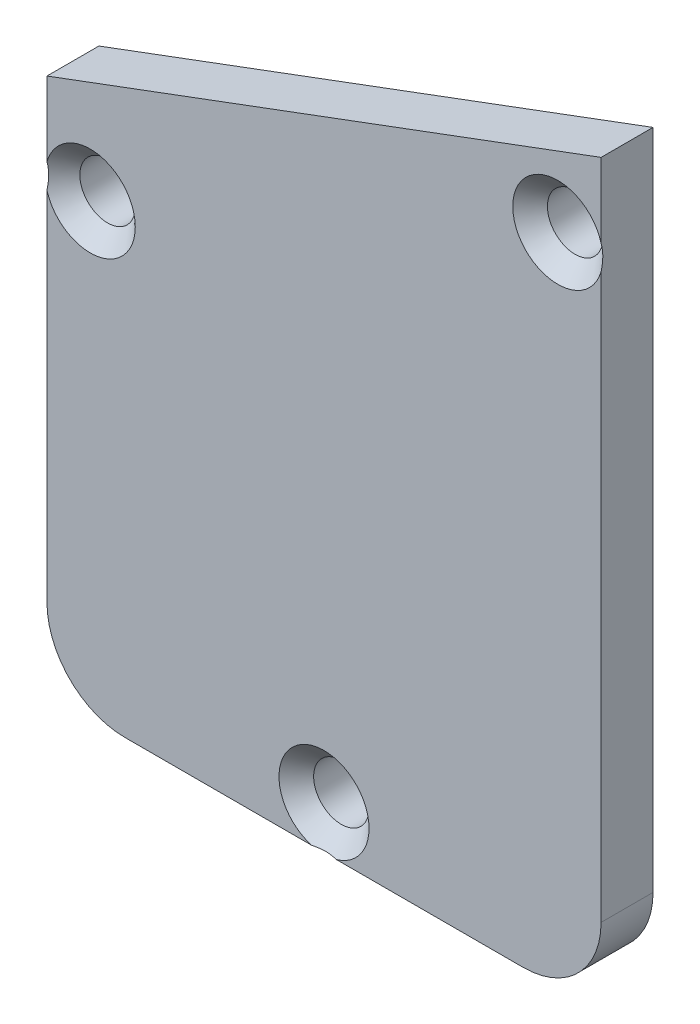
ISO-10303-21;
HEADER;
FILE_DESCRIPTION(('STEP AP214'),'2;1');
FILE_NAME('part.step','',(''),(''),'','','');
FILE_SCHEMA(('AUTOMOTIVE_DESIGN { 1 0 10303 214 1 1 1 1 }'));
ENDSEC;
DATA;
#1=APPLICATION_CONTEXT('core data for automotive mechanical design processes');
#2=APPLICATION_PROTOCOL_DEFINITION('international standard','automotive_design',2000,#1);
#3=PRODUCT_CONTEXT('',#1,'mechanical');
#4=PRODUCT('Part','Part','',(#3));
#5=PRODUCT_RELATED_PRODUCT_CATEGORY('part','',(#4));
#6=PRODUCT_DEFINITION_FORMATION('','',#4);
#7=PRODUCT_DEFINITION_CONTEXT('part definition',#1,'design');
#8=PRODUCT_DEFINITION('design','',#6,#7);
#9=PRODUCT_DEFINITION_SHAPE('','',#8);
#10=(LENGTH_UNIT() NAMED_UNIT(*) SI_UNIT(.MILLI.,.METRE.));
#11=(NAMED_UNIT(*) PLANE_ANGLE_UNIT() SI_UNIT($,.RADIAN.));
#12=(NAMED_UNIT(*) SI_UNIT($,.STERADIAN.) SOLID_ANGLE_UNIT());
#13=UNCERTAINTY_MEASURE_WITH_UNIT(LENGTH_MEASURE(1.E-05),#10,'distance_accuracy_value','');
#14=(GEOMETRIC_REPRESENTATION_CONTEXT(3) GLOBAL_UNCERTAINTY_ASSIGNED_CONTEXT((#13)) GLOBAL_UNIT_ASSIGNED_CONTEXT((#10,
#11,#12)) REPRESENTATION_CONTEXT('',''));
#15=CARTESIAN_POINT('',(0.,0.,0.));
#16=DIRECTION('',(0.,0.,1.));
#17=DIRECTION('',(1.,0.,0.));
#18=AXIS2_PLACEMENT_3D('',#15,#16,#17);
#19=CARTESIAN_POINT('',(12.2995585200825,-15.5607692307692,3.));
#20=DIRECTION('',(0.,0.,-1.));
#21=DIRECTION('',(-1.,0.,0.));
#22=AXIS2_PLACEMENT_3D('',#19,#20,#21);
#23=CYLINDRICAL_SURFACE('',#22,4.5);
#24=CARTESIAN_POINT('',(12.2995585200825,-15.5607692307692,0.));
#25=DIRECTION('',(0.,0.,1.));
#26=DIRECTION('',(1.,0.,0.));
#27=AXIS2_PLACEMENT_3D('',#24,#25,#26);
#28=CIRCLE('',#27,4.5);
#29=CARTESIAN_POINT('',(12.2995585200825,-20.0607692307692,0.));
#30=VERTEX_POINT('',#29);
#31=CARTESIAN_POINT('',(16.7995585200825,-15.5607692307692,0.));
#32=VERTEX_POINT('',#31);
#33=EDGE_CURVE('E151',#30,#32,#28,.T.);
#34=ORIENTED_EDGE('',*,*,#33,.T.);
#35=DIRECTION('',(0.,0.,-1.));
#36=VECTOR('',#35,1.);
#37=CARTESIAN_POINT('',(16.7995585200825,-15.5607692307692,3.));
#38=LINE('',#37,#36);
#39=CARTESIAN_POINT('',(16.7995585200825,-15.5607692307692,3.));
#40=VERTEX_POINT('',#39);
#41=EDGE_CURVE('E130',#40,#32,#38,.T.);
#42=ORIENTED_EDGE('',*,*,#41,.F.);
#43=CARTESIAN_POINT('',(12.2995585200825,-15.5607692307692,3.));
#44=DIRECTION('',(0.,0.,1.));
#45=DIRECTION('',(1.,0.,0.));
#46=AXIS2_PLACEMENT_3D('',#43,#44,#45);
#47=CIRCLE('',#46,4.5);
#48=CARTESIAN_POINT('',(12.2995585200825,-20.0607692307692,3.));
#49=VERTEX_POINT('',#48);
#50=EDGE_CURVE('E141',#49,#40,#47,.T.);
#51=ORIENTED_EDGE('',*,*,#50,.F.);
#52=DIRECTION('',(0.,0.,-1.));
#53=VECTOR('',#52,1.);
#54=CARTESIAN_POINT('',(12.2995585200825,-20.0607692307692,3.));
#55=LINE('',#54,#53);
#56=EDGE_CURVE('E358',#49,#30,#55,.T.);
#57=ORIENTED_EDGE('',*,*,#56,.T.);
#58=EDGE_LOOP('',(#34,#42,#51,#57));
#59=FACE_BOUND('',#58,.T.);
#60=ADVANCED_FACE('F47',(#59),#23,.T.);
#61=CARTESIAN_POINT('',(16.7995585200825,22.6992307692308,3.));
#62=DIRECTION('',(-1.,0.,0.));
#63=DIRECTION('',(0.,0.,1.));
#64=AXIS2_PLACEMENT_3D('',#61,#62,#63);
#65=PLANE('',#64);
#66=DIRECTION('',(0.,1.,0.));
#67=VECTOR('',#66,1.);
#68=CARTESIAN_POINT('',(16.7995585200825,22.6992307692308,3.));
#69=LINE('',#68,#67);
#70=CARTESIAN_POINT('',(16.7995585200825,18.4133736120851,3.));
#71=VERTEX_POINT('',#70);
#72=CARTESIAN_POINT('',(16.7995585200825,22.6992307692308,3.));
#73=VERTEX_POINT('',#72);
#74=EDGE_CURVE('E138',#71,#73,#69,.T.);
#75=ORIENTED_EDGE('',*,*,#74,.F.);
#76=CARTESIAN_POINT('',(16.7995585200825,18.4133736120851,3.));
#77=CARTESIAN_POINT('',(16.7995585200825,18.3507922140833,2.98279216688061));
#78=CARTESIAN_POINT('',(16.7995585200825,18.2876418998736,2.96755299884753));
#79=CARTESIAN_POINT('',(16.7995585200825,18.1603981953197,2.94142098615718));
#80=CARTESIAN_POINT('',(16.7995585200825,18.0963040701007,2.93053173664374));
#81=CARTESIAN_POINT('',(16.7995585200825,17.9687755131739,2.91371032546571));
#82=CARTESIAN_POINT('',(16.7995585200825,17.9053539913375,2.90768228055086));
#83=CARTESIAN_POINT('',(16.7995585200825,17.7782756583968,2.90044320306248));
#84=CARTESIAN_POINT('',(16.7995585200825,17.7146189692224,2.8992299514041));
#85=CARTESIAN_POINT('',(16.7995585200825,17.5395267168031,2.90262959530676));
#86=CARTESIAN_POINT('',(16.7995585200825,17.4281415377014,2.91230697717625));
#87=CARTESIAN_POINT('',(16.7995585200825,17.2617522742746,2.93737434116589));
#88=CARTESIAN_POINT('',(16.7995585200825,17.2058965710592,2.94763253726079));
#89=CARTESIAN_POINT('',(16.7995585200825,17.0949222259566,2.97143178889876));
#90=CARTESIAN_POINT('',(16.7995585200825,17.0398031505073,2.98497081472162));
#91=CARTESIAN_POINT('',(16.7995585200825,16.9850879263765,3.));
#92=B_SPLINE_CURVE_WITH_KNOTS('',3,(#76,#77,#78,#79,#80,#81,#82,#83,#84,#85,#86,#87,#88,#89,#90,
#91),.UNSPECIFIED.,.F.,.F.,(4,2,2,2,2,2,2,4),(0.,0.194719759098645,0.389600119899325,
0.580535556078679,0.771382982004303,1.10567595081882,1.27596586246087,1.4461506902036),.UNSPECIFIED.);
#93=CARTESIAN_POINT('',(16.7995585200825,16.9850879263765,3.));
#94=VERTEX_POINT('',#93);
#95=EDGE_CURVE('E132',#71,#94,#92,.T.);
#96=ORIENTED_EDGE('',*,*,#95,.T.);
#97=EDGE_CURVE('E125',#40,#94,#69,.T.);
#98=ORIENTED_EDGE('',*,*,#97,.F.);
#99=ORIENTED_EDGE('',*,*,#41,.T.);
#100=DIRECTION('',(0.,1.,0.));
#101=VECTOR('',#100,1.);
#102=CARTESIAN_POINT('',(16.7995585200825,22.6992307692308,0.));
#103=LINE('',#102,#101);
#104=CARTESIAN_POINT('',(16.7995585200825,22.6992307692308,0.));
#105=VERTEX_POINT('',#104);
#106=EDGE_CURVE('E337',#32,#105,#103,.T.);
#107=ORIENTED_EDGE('',*,*,#106,.T.);
#108=DIRECTION('',(0.,0.,-1.));
#109=VECTOR('',#108,1.);
#110=CARTESIAN_POINT('',(16.7995585200825,22.6992307692308,3.));
#111=LINE('',#110,#109);
#112=EDGE_CURVE('E154',#73,#105,#111,.T.);
#113=ORIENTED_EDGE('',*,*,#112,.F.);
#114=EDGE_LOOP('',(#75,#96,#98,#99,#107,#113));
#115=FACE_BOUND('',#114,.T.);
#116=ADVANCED_FACE('F128',(#115),#65,.F.);
#117=CARTESIAN_POINT('',(16.7995585200825,22.6992307692308,3.));
#118=DIRECTION('',(0.349325806105883,-0.937001324005721,0.));
#119=DIRECTION('',(0.937001324005721,0.349325806105883,0.));
#120=AXIS2_PLACEMENT_3D('',#117,#118,#119);
#121=PLANE('',#120);
#122=DIRECTION('',(-0.937001324005721,-0.349325806105883,0.));
#123=VECTOR('',#122,1.);
#124=CARTESIAN_POINT('',(16.7995585200825,22.6992307692308,0.));
#125=LINE('',#124,#123);
#126=CARTESIAN_POINT('',(-15.2004414799175,10.7692307692308,0.));
#127=VERTEX_POINT('',#126);
#128=EDGE_CURVE('E362',#105,#127,#125,.T.);
#129=ORIENTED_EDGE('',*,*,#128,.T.);
#130=DIRECTION('',(0.,0.,-1.));
#131=VECTOR('',#130,1.);
#132=CARTESIAN_POINT('',(-15.2004414799175,10.7692307692308,3.));
#133=LINE('',#132,#131);
#134=CARTESIAN_POINT('',(-15.2004414799175,10.7692307692308,3.));
#135=VERTEX_POINT('',#134);
#136=EDGE_CURVE('E162',#135,#127,#133,.T.);
#137=ORIENTED_EDGE('',*,*,#136,.F.);
#138=DIRECTION('',(-0.937001324005721,-0.349325806105883,0.));
#139=VECTOR('',#138,1.);
#140=CARTESIAN_POINT('',(16.7995585200825,22.6992307692308,3.));
#141=LINE('',#140,#139);
#142=EDGE_CURVE('E137',#73,#135,#141,.T.);
#143=ORIENTED_EDGE('',*,*,#142,.F.);
#144=ORIENTED_EDGE('',*,*,#112,.T.);
#145=EDGE_LOOP('',(#129,#137,#143,#144));
#146=FACE_BOUND('',#145,.T.);
#147=ADVANCED_FACE('F203',(#146),#121,.F.);
#148=CARTESIAN_POINT('',(-15.2004414799175,10.7692307692308,3.));
#149=DIRECTION('',(1.,0.,0.));
#150=DIRECTION('',(0.,1.,0.));
#151=AXIS2_PLACEMENT_3D('',#148,#149,#150);
#152=PLANE('',#151);
#153=DIRECTION('',(0.,-1.,0.));
#154=VECTOR('',#153,1.);
#155=CARTESIAN_POINT('',(-15.2004414799175,10.7692307692308,3.));
#156=LINE('',#155,#154);
#157=CARTESIAN_POINT('',(-15.2004414799175,5.05508792637645,3.));
#158=VERTEX_POINT('',#157);
#159=CARTESIAN_POINT('',(-15.2004414799175,-15.5607692307692,3.));
#160=VERTEX_POINT('',#159);
#161=EDGE_CURVE('E348',#158,#160,#156,.T.);
#162=ORIENTED_EDGE('',*,*,#161,.F.);
#163=CARTESIAN_POINT('',(-15.2004414799175,5.05508792637645,3.));
#164=CARTESIAN_POINT('',(-15.2004414799175,5.11766932437823,2.98279216688061));
#165=CARTESIAN_POINT('',(-15.2004414799175,5.18081963858794,2.96755299884753));
#166=CARTESIAN_POINT('',(-15.2004414799175,5.30806334314185,2.94142098615718));
#167=CARTESIAN_POINT('',(-15.2004414799175,5.37215746836082,2.93053173664373));
#168=CARTESIAN_POINT('',(-15.2004414799175,5.49968602528759,2.91371032546571));
#169=CARTESIAN_POINT('',(-15.2004414799175,5.56310754712399,2.90768228055085));
#170=CARTESIAN_POINT('',(-15.2004414799175,5.69018588006468,2.90044320306247));
#171=CARTESIAN_POINT('',(-15.2004414799175,5.7538425692391,2.8992299514041));
#172=CARTESIAN_POINT('',(-15.2004414799175,5.92893482165844,2.90262959530676));
#173=CARTESIAN_POINT('',(-15.2004414799175,6.04032000076017,2.91230697717625));
#174=CARTESIAN_POINT('',(-15.2004414799175,6.20670926418689,2.93737434116588));
#175=CARTESIAN_POINT('',(-15.2004414799175,6.26256496740231,2.94763253726078));
#176=CARTESIAN_POINT('',(-15.2004414799175,6.37353931250492,2.97143178889876));
#177=CARTESIAN_POINT('',(-15.2004414799175,6.42865838795425,2.98497081472162));
#178=CARTESIAN_POINT('',(-15.2004414799175,6.48337361208508,3.));
#179=B_SPLINE_CURVE_WITH_KNOTS('',3,(#163,#164,#165,#166,#167,#168,#169,#170,#171,#172,#173,
#174,#175,#176,#177,#178),.UNSPECIFIED.,.F.,.F.,(4,2,2,2,2,2,2,4),(0.,0.194719759098642,
0.389600119899326,0.580535556078682,0.771382982004305,1.10567595081884,1.2759658624609,
1.44615069020365),.UNSPECIFIED.);
#180=CARTESIAN_POINT('',(-15.2004414799175,6.48337361208508,3.));
#181=VERTEX_POINT('',#180);
#182=EDGE_CURVE('E11',#158,#181,#179,.T.);
#183=ORIENTED_EDGE('',*,*,#182,.T.);
#184=EDGE_CURVE('E349',#135,#181,#156,.T.);
#185=ORIENTED_EDGE('',*,*,#184,.F.);
#186=ORIENTED_EDGE('',*,*,#136,.T.);
#187=DIRECTION('',(0.,-1.,0.));
#188=VECTOR('',#187,1.);
#189=CARTESIAN_POINT('',(-15.2004414799175,10.7692307692308,0.));
#190=LINE('',#189,#188);
#191=CARTESIAN_POINT('',(-15.2004414799175,-15.5607692307692,0.));
#192=VERTEX_POINT('',#191);
#193=EDGE_CURVE('E365',#127,#192,#190,.T.);
#194=ORIENTED_EDGE('',*,*,#193,.T.);
#195=DIRECTION('',(0.,0.,-1.));
#196=VECTOR('',#195,1.);
#197=CARTESIAN_POINT('',(-15.2004414799175,-15.5607692307692,3.));
#198=LINE('',#197,#196);
#199=EDGE_CURVE('E379',#160,#192,#198,.T.);
#200=ORIENTED_EDGE('',*,*,#199,.F.);
#201=EDGE_LOOP('',(#162,#183,#185,#186,#194,#200));
#202=FACE_BOUND('',#201,.T.);
#203=ADVANCED_FACE('F198',(#202),#152,.F.);
#204=CARTESIAN_POINT('',(-10.7004414799175,-15.5607692307692,3.));
#205=DIRECTION('',(0.,0.,-1.));
#206=DIRECTION('',(-1.,0.,0.));
#207=AXIS2_PLACEMENT_3D('',#204,#205,#206);
#208=CYLINDRICAL_SURFACE('',#207,4.5);
#209=CARTESIAN_POINT('',(-10.7004414799175,-15.5607692307692,0.));
#210=DIRECTION('',(0.,0.,1.));
#211=DIRECTION('',(1.,0.,0.));
#212=AXIS2_PLACEMENT_3D('',#209,#210,#211);
#213=CIRCLE('',#212,4.5);
#214=CARTESIAN_POINT('',(-10.7004414799175,-20.0607692307692,0.));
#215=VERTEX_POINT('',#214);
#216=EDGE_CURVE('E368',#192,#215,#213,.T.);
#217=ORIENTED_EDGE('',*,*,#216,.T.);
#218=DIRECTION('',(0.,0.,-1.));
#219=VECTOR('',#218,1.);
#220=CARTESIAN_POINT('',(-10.7004414799175,-20.0607692307692,3.));
#221=LINE('',#220,#219);
#222=CARTESIAN_POINT('',(-10.7004414799175,-20.0607692307692,3.));
#223=VERTEX_POINT('',#222);
#224=EDGE_CURVE('E375',#223,#215,#221,.T.);
#225=ORIENTED_EDGE('',*,*,#224,.F.);
#226=CARTESIAN_POINT('',(-10.7004414799175,-15.5607692307692,3.));
#227=DIRECTION('',(0.,0.,1.));
#228=DIRECTION('',(1.,0.,0.));
#229=AXIS2_PLACEMENT_3D('',#226,#227,#228);
#230=CIRCLE('',#229,4.5);
#231=EDGE_CURVE('E353',#160,#223,#230,.T.);
#232=ORIENTED_EDGE('',*,*,#231,.F.);
#233=ORIENTED_EDGE('',*,*,#199,.T.);
#234=EDGE_LOOP('',(#217,#225,#232,#233));
#235=FACE_BOUND('',#234,.T.);
#236=ADVANCED_FACE('F194',(#235),#208,.T.);
#237=CARTESIAN_POINT('',(-10.7004414799175,-20.0607692307692,3.));
#238=DIRECTION('',(0.,1.,0.));
#239=DIRECTION('',(0.,0.,1.));
#240=AXIS2_PLACEMENT_3D('',#237,#238,#239);
#241=PLANE('',#240);
#242=DIRECTION('',(1.,0.,0.));
#243=VECTOR('',#242,1.);
#244=CARTESIAN_POINT('',(-10.7004414799175,-20.0607692307692,3.));
#245=LINE('',#244,#243);
#246=CARTESIAN_POINT('',(1.51370136293689,-20.0607692307692,3.));
#247=VERTEX_POINT('',#246);
#248=EDGE_CURVE('E143',#247,#49,#245,.T.);
#249=ORIENTED_EDGE('',*,*,#248,.F.);
#250=CARTESIAN_POINT('',(1.51370136293689,-20.0607692307692,3.));
#251=CARTESIAN_POINT('',(1.45111996493511,-20.0607692307692,2.98279216688061));
#252=CARTESIAN_POINT('',(1.3879696507254,-20.0607692307692,2.96755299884753));
#253=CARTESIAN_POINT('',(1.26072594617149,-20.0607692307692,2.94142098615718));
#254=CARTESIAN_POINT('',(1.19663182095252,-20.0607692307692,2.93053173664373));
#255=CARTESIAN_POINT('',(1.06910326402575,-20.0607692307692,2.9137103254657));
#256=CARTESIAN_POINT('',(1.00568174218935,-20.0607692307692,2.90768228055084));
#257=CARTESIAN_POINT('',(0.878603409248664,-20.0607692307692,2.90044320306246));
#258=CARTESIAN_POINT('',(0.81494672007424,-20.0607692307692,2.89922995140409));
#259=CARTESIAN_POINT('',(0.639854467654892,-20.0607692307692,2.90262959530674));
#260=CARTESIAN_POINT('',(0.528469288553146,-20.0607692307692,2.91230697717623));
#261=CARTESIAN_POINT('',(0.362080025126407,-20.0607692307692,2.93737434116587));
#262=CARTESIAN_POINT('',(0.306224321910981,-20.0607692307692,2.94763253726077));
#263=CARTESIAN_POINT('',(0.195249976808351,-20.0607692307692,2.97143178889875));
#264=CARTESIAN_POINT('',(0.140130901359014,-20.0607692307692,2.98497081472162));
#265=CARTESIAN_POINT('',(0.0854156772281763,-20.0607692307692,3.));
#266=B_SPLINE_CURVE_WITH_KNOTS('',3,(#250,#251,#252,#253,#254,#255,#256,#257,#258,#259,#260,
#261,#262,#263,#264,#265),.UNSPECIFIED.,.F.,.F.,(4,2,2,2,2,2,2,4),(0.,0.194719759098644,
0.389600119899326,0.580535556078682,0.771382982004306,1.10567595081888,1.27596586246096,
1.44615069020373),.UNSPECIFIED.);
#267=CARTESIAN_POINT('',(0.0854156772281765,-20.0607692307692,3.));
#268=VERTEX_POINT('',#267);
#269=EDGE_CURVE('E69',#247,#268,#266,.T.);
#270=ORIENTED_EDGE('',*,*,#269,.T.);
#271=EDGE_CURVE('E356',#223,#268,#245,.T.);
#272=ORIENTED_EDGE('',*,*,#271,.F.);
#273=ORIENTED_EDGE('',*,*,#224,.T.);
#274=DIRECTION('',(1.,0.,0.));
#275=VECTOR('',#274,1.);
#276=CARTESIAN_POINT('',(-10.7004414799175,-20.0607692307692,0.));
#277=LINE('',#276,#275);
#278=EDGE_CURVE('E148',#215,#30,#277,.T.);
#279=ORIENTED_EDGE('',*,*,#278,.T.);
#280=ORIENTED_EDGE('',*,*,#56,.F.);
#281=EDGE_LOOP('',(#249,#270,#272,#273,#279,#280));
#282=FACE_BOUND('',#281,.T.);
#283=ADVANCED_FACE('F189',(#282),#241,.F.);
#284=CARTESIAN_POINT('',(12.2995585200825,-15.5607692307692,3.));
#285=DIRECTION('',(0.,0.,1.));
#286=DIRECTION('',(1.,0.,0.));
#287=AXIS2_PLACEMENT_3D('',#284,#285,#286);
#288=PLANE('',#287);
#289=ORIENTED_EDGE('',*,*,#271,.T.);
#290=CARTESIAN_POINT('',(0.799558520082535,-17.5607692307692,3.));
#291=DIRECTION('',(0.,0.,1.));
#292=DIRECTION('',(1.,0.,0.));
#293=AXIS2_PLACEMENT_3D('',#290,#291,#292);
#294=CIRCLE('',#293,2.60000000000002);
#295=EDGE_CURVE('E172',#268,#247,#294,.F.);
#296=ORIENTED_EDGE('',*,*,#295,.T.);
#297=ORIENTED_EDGE('',*,*,#248,.T.);
#298=ORIENTED_EDGE('',*,*,#50,.T.);
#299=ORIENTED_EDGE('',*,*,#97,.T.);
#300=CARTESIAN_POINT('',(14.2995585200825,17.6992307692308,3.));
#301=DIRECTION('',(0.,0.,1.));
#302=DIRECTION('',(1.,0.,0.));
#303=AXIS2_PLACEMENT_3D('',#300,#301,#302);
#304=CIRCLE('',#303,2.6);
#305=EDGE_CURVE('E169',#94,#71,#304,.F.);
#306=ORIENTED_EDGE('',*,*,#305,.T.);
#307=ORIENTED_EDGE('',*,*,#74,.T.);
#308=ORIENTED_EDGE('',*,*,#142,.T.);
#309=ORIENTED_EDGE('',*,*,#184,.T.);
#310=CARTESIAN_POINT('',(-12.7004414799175,5.76923076923077,3.));
#311=DIRECTION('',(0.,0.,1.));
#312=DIRECTION('',(1.,0.,0.));
#313=AXIS2_PLACEMENT_3D('',#310,#311,#312);
#314=CIRCLE('',#313,2.60000000000001);
#315=EDGE_CURVE('E159',#181,#158,#314,.F.);
#316=ORIENTED_EDGE('',*,*,#315,.T.);
#317=ORIENTED_EDGE('',*,*,#161,.T.);
#318=ORIENTED_EDGE('',*,*,#231,.T.);
#319=EDGE_LOOP('',(#289,#296,#297,#298,#299,#306,#307,#308,#309,#316,#317,#318));
#320=FACE_BOUND('',#319,.T.);
#321=ADVANCED_FACE('F142',(#320),#288,.T.);
#322=CARTESIAN_POINT('',(12.2995585200825,-15.5607692307692,0.));
#323=DIRECTION('',(0.,0.,1.));
#324=DIRECTION('',(1.,0.,0.));
#325=AXIS2_PLACEMENT_3D('',#322,#323,#324);
#326=PLANE('',#325);
#327=CARTESIAN_POINT('',(-12.7004414799175,5.76923076923077,0.));
#328=DIRECTION('',(0.,0.,1.));
#329=DIRECTION('',(1.,0.,0.));
#330=AXIS2_PLACEMENT_3D('',#327,#328,#329);
#331=CIRCLE('',#330,1.6);
#332=CARTESIAN_POINT('',(-11.1004414799175,5.76923076923077,0.));
#333=VERTEX_POINT('',#332);
#334=EDGE_CURVE('E331',#333,#333,#331,.T.);
#335=ORIENTED_EDGE('',*,*,#334,.T.);
#336=EDGE_LOOP('',(#335));
#337=FACE_BOUND('',#336,.T.);
#338=CARTESIAN_POINT('',(14.2995585200825,17.6992307692308,0.));
#339=DIRECTION('',(0.,0.,1.));
#340=DIRECTION('',(1.,0.,0.));
#341=AXIS2_PLACEMENT_3D('',#338,#339,#340);
#342=CIRCLE('',#341,1.6);
#343=CARTESIAN_POINT('',(15.8995585200825,17.6992307692308,0.));
#344=VERTEX_POINT('',#343);
#345=EDGE_CURVE('E333',#344,#344,#342,.T.);
#346=ORIENTED_EDGE('',*,*,#345,.T.);
#347=EDGE_LOOP('',(#346));
#348=FACE_BOUND('',#347,.T.);
#349=CARTESIAN_POINT('',(0.799558520082535,-17.5607692307692,0.));
#350=DIRECTION('',(0.,0.,1.));
#351=DIRECTION('',(1.,0.,0.));
#352=AXIS2_PLACEMENT_3D('',#349,#350,#351);
#353=CIRCLE('',#352,1.6);
#354=CARTESIAN_POINT('',(2.39955852008253,-17.5607692307692,0.));
#355=VERTEX_POINT('',#354);
#356=EDGE_CURVE('E340',#355,#355,#353,.T.);
#357=ORIENTED_EDGE('',*,*,#356,.T.);
#358=EDGE_LOOP('',(#357));
#359=FACE_BOUND('',#358,.T.);
#360=ORIENTED_EDGE('',*,*,#33,.F.);
#361=ORIENTED_EDGE('',*,*,#278,.F.);
#362=ORIENTED_EDGE('',*,*,#216,.F.);
#363=ORIENTED_EDGE('',*,*,#193,.F.);
#364=ORIENTED_EDGE('',*,*,#128,.F.);
#365=ORIENTED_EDGE('',*,*,#106,.F.);
#366=EDGE_LOOP('',(#360,#361,#362,#363,#364,#365));
#367=FACE_BOUND('',#366,.T.);
#368=ADVANCED_FACE('F195',(#337,#348,#359,#367),#326,.F.);
#369=CARTESIAN_POINT('',(0.799558520082535,-17.5607692307692,0.));
#370=DIRECTION('',(0.,0.,1.));
#371=DIRECTION('',(1.,0.,0.));
#372=AXIS2_PLACEMENT_3D('',#369,#370,#371);
#373=CYLINDRICAL_SURFACE('',#372,1.6);
#374=CARTESIAN_POINT('',(0.799558520082535,-17.5607692307692,1.99999999999998));
#375=DIRECTION('',(0.,0.,1.));
#376=DIRECTION('',(1.,0.,0.));
#377=AXIS2_PLACEMENT_3D('',#374,#375,#376);
#378=CIRCLE('',#377,1.6);
#379=CARTESIAN_POINT('',(2.39955852008253,-17.5607692307692,1.99999999999998));
#380=VERTEX_POINT('',#379);
#381=EDGE_CURVE('E153',#380,#380,#378,.T.);
#382=ORIENTED_EDGE('',*,*,#381,.T.);
#383=EDGE_LOOP('',(#382));
#384=FACE_BOUND('',#383,.T.);
#385=ORIENTED_EDGE('',*,*,#356,.F.);
#386=EDGE_LOOP('',(#385));
#387=FACE_BOUND('',#386,.T.);
#388=ADVANCED_FACE('F251',(#384,#387),#373,.F.);
#389=CARTESIAN_POINT('',(14.2995585200825,17.6992307692308,0.));
#390=DIRECTION('',(0.,0.,1.));
#391=DIRECTION('',(1.,0.,0.));
#392=AXIS2_PLACEMENT_3D('',#389,#390,#391);
#393=CYLINDRICAL_SURFACE('',#392,1.6);
#394=CARTESIAN_POINT('',(14.2995585200825,17.6992307692308,2.));
#395=DIRECTION('',(0.,0.,1.));
#396=DIRECTION('',(1.,0.,0.));
#397=AXIS2_PLACEMENT_3D('',#394,#395,#396);
#398=CIRCLE('',#397,1.6);
#399=CARTESIAN_POINT('',(15.8995585200825,17.6992307692308,2.));
#400=VERTEX_POINT('',#399);
#401=EDGE_CURVE('E183',#400,#400,#398,.T.);
#402=ORIENTED_EDGE('',*,*,#401,.T.);
#403=EDGE_LOOP('',(#402));
#404=FACE_BOUND('',#403,.T.);
#405=ORIENTED_EDGE('',*,*,#345,.F.);
#406=EDGE_LOOP('',(#405));
#407=FACE_BOUND('',#406,.T.);
#408=ADVANCED_FACE('F278',(#404,#407),#393,.F.);
#409=CARTESIAN_POINT('',(-12.7004414799175,5.76923076923077,0.));
#410=DIRECTION('',(0.,0.,1.));
#411=DIRECTION('',(1.,0.,0.));
#412=AXIS2_PLACEMENT_3D('',#409,#410,#411);
#413=CYLINDRICAL_SURFACE('',#412,1.6);
#414=CARTESIAN_POINT('',(-12.7004414799175,5.76923076923077,1.99999999999998));
#415=DIRECTION('',(0.,0.,1.));
#416=DIRECTION('',(1.,0.,0.));
#417=AXIS2_PLACEMENT_3D('',#414,#415,#416);
#418=CIRCLE('',#417,1.6);
#419=CARTESIAN_POINT('',(-11.1004414799175,5.76923076923077,1.99999999999998));
#420=VERTEX_POINT('',#419);
#421=EDGE_CURVE('E63',#420,#420,#418,.T.);
#422=ORIENTED_EDGE('',*,*,#421,.T.);
#423=EDGE_LOOP('',(#422));
#424=FACE_BOUND('',#423,.T.);
#425=ORIENTED_EDGE('',*,*,#334,.F.);
#426=EDGE_LOOP('',(#425));
#427=FACE_BOUND('',#426,.T.);
#428=ADVANCED_FACE('F227',(#424,#427),#413,.F.);
#429=CARTESIAN_POINT('',(0.799558520082535,-17.5607692307692,1.99999999999998));
#430=DIRECTION('',(0.,0.,1.));
#431=DIRECTION('',(1.,0.,0.));
#432=AXIS2_PLACEMENT_3D('',#429,#430,#431);
#433=CONICAL_SURFACE('',#432,1.6,0.785398163397449);
#434=ORIENTED_EDGE('',*,*,#269,.F.);
#435=ORIENTED_EDGE('',*,*,#295,.F.);
#436=EDGE_LOOP('',(#434,#435));
#437=FACE_BOUND('',#436,.T.);
#438=ORIENTED_EDGE('',*,*,#381,.F.);
#439=EDGE_LOOP('',(#438));
#440=FACE_BOUND('',#439,.T.);
#441=ADVANCED_FACE('F186',(#437,#440),#433,.F.);
#442=CARTESIAN_POINT('',(14.2995585200825,17.6992307692308,2.));
#443=DIRECTION('',(0.,0.,1.));
#444=DIRECTION('',(1.,0.,0.));
#445=AXIS2_PLACEMENT_3D('',#442,#443,#444);
#446=CONICAL_SURFACE('',#445,1.6,0.785398163397448);
#447=ORIENTED_EDGE('',*,*,#95,.F.);
#448=ORIENTED_EDGE('',*,*,#305,.F.);
#449=EDGE_LOOP('',(#447,#448));
#450=FACE_BOUND('',#449,.T.);
#451=ORIENTED_EDGE('',*,*,#401,.F.);
#452=EDGE_LOOP('',(#451));
#453=FACE_BOUND('',#452,.T.);
#454=ADVANCED_FACE('F216',(#450,#453),#446,.F.);
#455=CARTESIAN_POINT('',(-12.7004414799175,5.76923076923077,1.99999999999998));
#456=DIRECTION('',(0.,0.,1.));
#457=DIRECTION('',(1.,0.,0.));
#458=AXIS2_PLACEMENT_3D('',#455,#456,#457);
#459=CONICAL_SURFACE('',#458,1.6,0.785398163397443);
#460=ORIENTED_EDGE('',*,*,#182,.F.);
#461=ORIENTED_EDGE('',*,*,#315,.F.);
#462=EDGE_LOOP('',(#460,#461));
#463=FACE_BOUND('',#462,.T.);
#464=ORIENTED_EDGE('',*,*,#421,.F.);
#465=EDGE_LOOP('',(#464));
#466=FACE_BOUND('',#465,.T.);
#467=ADVANCED_FACE('F50',(#463,#466),#459,.F.);
#468=CLOSED_SHELL('',(#60,#116,#147,#203,#236,#283,#321,#368,#388,#408,#428,#441,#454,#467));
#469=MANIFOLD_SOLID_BREP('B2',#468);
#470=ADVANCED_BREP_SHAPE_REPRESENTATION('',(#18,#469),#14);
#471=SHAPE_DEFINITION_REPRESENTATION(#9,#470);
ENDSEC;
END-ISO-10303-21;
